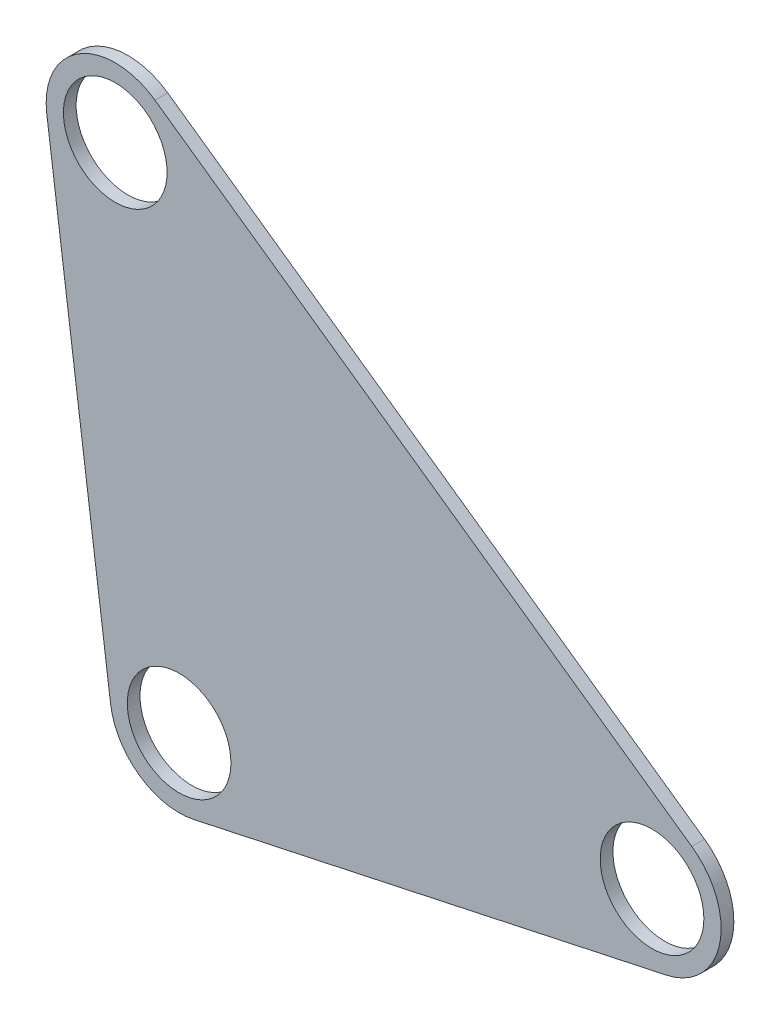
ISO-10303-21;
HEADER;
FILE_DESCRIPTION(('STEP AP214'),'2;1');
FILE_NAME('part.step','',(''),(''),'','','');
FILE_SCHEMA(('AUTOMOTIVE_DESIGN { 1 0 10303 214 1 1 1 1 }'));
ENDSEC;
DATA;
#1=APPLICATION_CONTEXT('core data for automotive mechanical design processes');
#2=APPLICATION_PROTOCOL_DEFINITION('international standard','automotive_design',2000,#1);
#3=PRODUCT_CONTEXT('',#1,'mechanical');
#4=PRODUCT('Part','Part','',(#3));
#5=PRODUCT_RELATED_PRODUCT_CATEGORY('part','',(#4));
#6=PRODUCT_DEFINITION_FORMATION('','',#4);
#7=PRODUCT_DEFINITION_CONTEXT('part definition',#1,'design');
#8=PRODUCT_DEFINITION('design','',#6,#7);
#9=PRODUCT_DEFINITION_SHAPE('','',#8);
#10=(LENGTH_UNIT() NAMED_UNIT(*) SI_UNIT(.MILLI.,.METRE.));
#11=(NAMED_UNIT(*) PLANE_ANGLE_UNIT() SI_UNIT($,.RADIAN.));
#12=(NAMED_UNIT(*) SI_UNIT($,.STERADIAN.) SOLID_ANGLE_UNIT());
#13=UNCERTAINTY_MEASURE_WITH_UNIT(LENGTH_MEASURE(1.E-05),#10,'distance_accuracy_value','');
#14=(GEOMETRIC_REPRESENTATION_CONTEXT(3) GLOBAL_UNCERTAINTY_ASSIGNED_CONTEXT((#13)) GLOBAL_UNIT_ASSIGNED_CONTEXT((#10,
#11,#12)) REPRESENTATION_CONTEXT('',''));
#15=CARTESIAN_POINT('',(0.,0.,0.));
#16=DIRECTION('',(0.,0.,1.));
#17=DIRECTION('',(1.,0.,0.));
#18=AXIS2_PLACEMENT_3D('',#15,#16,#17);
#19=CARTESIAN_POINT('',(31.7651022120724,-5.87017847864854,-0.7366));
#20=DIRECTION('',(0.,0.,1.));
#21=DIRECTION('',(1.,0.,0.));
#22=AXIS2_PLACEMENT_3D('',#19,#20,#21);
#23=CYLINDRICAL_SURFACE('',#22,4.);
#24=CARTESIAN_POINT('',(31.7651022120724,-5.87017847864854,0.));
#25=DIRECTION('',(0.,0.,1.));
#26=DIRECTION('',(-1.,0.,0.));
#27=AXIS2_PLACEMENT_3D('',#24,#25,#26);
#28=CIRCLE('',#27,4.);
#29=CARTESIAN_POINT('',(27.8001194318302,-6.39829925307725,0.));
#30=VERTEX_POINT('',#29);
#31=CARTESIAN_POINT('',(32.6051262996845,-9.78097884842344,0.));
#32=VERTEX_POINT('',#31);
#33=EDGE_CURVE('E126',#30,#32,#28,.T.);
#34=ORIENTED_EDGE('',*,*,#33,.F.);
#35=DIRECTION('',(0.,0.,1.));
#36=VECTOR('',#35,1.);
#37=CARTESIAN_POINT('',(27.8001194318302,-6.39829925307725,-0.7366));
#38=LINE('',#37,#36);
#39=CARTESIAN_POINT('',(27.8001194318302,-6.39829925307725,-0.7366));
#40=VERTEX_POINT('',#39);
#41=EDGE_CURVE('E11',#40,#30,#38,.T.);
#42=ORIENTED_EDGE('',*,*,#41,.F.);
#43=CARTESIAN_POINT('',(31.7651022120724,-5.87017847864854,-0.7366));
#44=DIRECTION('',(0.,0.,1.));
#45=DIRECTION('',(-1.,0.,0.));
#46=AXIS2_PLACEMENT_3D('',#43,#44,#45);
#47=CIRCLE('',#46,4.);
#48=CARTESIAN_POINT('',(32.6051262996845,-9.78097884842344,-0.7366));
#49=VERTEX_POINT('',#48);
#50=EDGE_CURVE('E141',#40,#49,#47,.T.);
#51=ORIENTED_EDGE('',*,*,#50,.T.);
#52=DIRECTION('',(0.,0.,1.));
#53=VECTOR('',#52,1.);
#54=CARTESIAN_POINT('',(32.6051262996845,-9.78097884842344,-0.7366));
#55=LINE('',#54,#53);
#56=EDGE_CURVE('E44',#49,#32,#55,.T.);
#57=ORIENTED_EDGE('',*,*,#56,.T.);
#58=EDGE_LOOP('',(#34,#42,#51,#57));
#59=FACE_BOUND('',#58,.T.);
#60=ADVANCED_FACE('F41',(#59),#23,.T.);
#61=CARTESIAN_POINT('',(27.8001194318302,-6.39829925307725,-0.7366));
#62=DIRECTION('',(-0.991245695060539,-0.132030193607179,0.));
#63=DIRECTION('',(0.132030193607179,-0.991245695060539,0.));
#64=AXIS2_PLACEMENT_3D('',#61,#62,#63);
#65=PLANE('',#64);
#66=DIRECTION('',(0.132030193607179,-0.991245695060539,0.));
#67=VECTOR('',#66,1.);
#68=CARTESIAN_POINT('',(27.8001194318302,-6.39829925307725,0.));
#69=LINE('',#68,#67);
#70=CARTESIAN_POINT('',(24.1032740108292,21.3565802086178,0.));
#71=VERTEX_POINT('',#70);
#72=EDGE_CURVE('E139',#71,#30,#69,.T.);
#73=ORIENTED_EDGE('',*,*,#72,.F.);
#74=DIRECTION('',(0.,0.,1.));
#75=VECTOR('',#74,1.);
#76=CARTESIAN_POINT('',(24.1032740108292,21.3565802086178,-0.7366));
#77=LINE('',#76,#75);
#78=CARTESIAN_POINT('',(24.1032740108292,21.3565802086178,-0.7366));
#79=VERTEX_POINT('',#78);
#80=EDGE_CURVE('E50',#79,#71,#77,.T.);
#81=ORIENTED_EDGE('',*,*,#80,.F.);
#82=DIRECTION('',(0.132030193607179,-0.991245695060539,0.));
#83=VECTOR('',#82,1.);
#84=CARTESIAN_POINT('',(27.8001194318302,-6.39829925307725,-0.7366));
#85=LINE('',#84,#83);
#86=EDGE_CURVE('E116',#79,#40,#85,.T.);
#87=ORIENTED_EDGE('',*,*,#86,.T.);
#88=ORIENTED_EDGE('',*,*,#41,.T.);
#89=EDGE_LOOP('',(#73,#81,#87,#88));
#90=FACE_BOUND('',#89,.T.);
#91=ADVANCED_FACE('F149',(#90),#65,.T.);
#92=CARTESIAN_POINT('',(28.0682567910714,21.8847009830465,-0.7366));
#93=DIRECTION('',(0.,0.,1.));
#94=DIRECTION('',(1.,0.,0.));
#95=AXIS2_PLACEMENT_3D('',#92,#93,#94);
#96=CYLINDRICAL_SURFACE('',#95,4.);
#97=CARTESIAN_POINT('',(28.0682567910714,21.8847009830465,0.));
#98=DIRECTION('',(0.,0.,1.));
#99=DIRECTION('',(1.,0.,0.));
#100=AXIS2_PLACEMENT_3D('',#97,#98,#99);
#101=CIRCLE('',#100,4.);
#102=CARTESIAN_POINT('',(30.3708579330093,25.1554849840387,0.));
#103=VERTEX_POINT('',#102);
#104=EDGE_CURVE('E103',#103,#71,#101,.T.);
#105=ORIENTED_EDGE('',*,*,#104,.F.);
#106=DIRECTION('',(0.,0.,1.));
#107=VECTOR('',#106,1.);
#108=CARTESIAN_POINT('',(30.3708579330093,25.1554849840387,-0.7366));
#109=LINE('',#108,#107);
#110=CARTESIAN_POINT('',(30.3708579330093,25.1554849840387,-0.7366));
#111=VERTEX_POINT('',#110);
#112=EDGE_CURVE('E98',#111,#103,#109,.T.);
#113=ORIENTED_EDGE('',*,*,#112,.F.);
#114=CARTESIAN_POINT('',(28.0682567910714,21.8847009830465,-0.7366));
#115=DIRECTION('',(0.,0.,1.));
#116=DIRECTION('',(1.,0.,0.));
#117=AXIS2_PLACEMENT_3D('',#114,#115,#116);
#118=CIRCLE('',#117,4.);
#119=EDGE_CURVE('E101',#111,#79,#118,.T.);
#120=ORIENTED_EDGE('',*,*,#119,.T.);
#121=ORIENTED_EDGE('',*,*,#80,.T.);
#122=EDGE_LOOP('',(#105,#113,#120,#121));
#123=FACE_BOUND('',#122,.T.);
#124=ADVANCED_FACE('F100',(#123),#96,.T.);
#125=CARTESIAN_POINT('',(61.4433059424346,3.28077413562832,-0.7366));
#126=DIRECTION('',(0.575650285484483,0.817696000248034,0.));
#127=DIRECTION('',(-0.817696000248034,0.575650285484483,0.));
#128=AXIS2_PLACEMENT_3D('',#125,#126,#127);
#129=PLANE('',#128);
#130=DIRECTION('',(-0.817696000248034,0.575650285484483,0.));
#131=VECTOR('',#130,1.);
#132=CARTESIAN_POINT('',(61.4433059424346,3.28077413562832,0.));
#133=LINE('',#132,#131);
#134=CARTESIAN_POINT('',(61.4433059424346,3.28077413562832,0.));
#135=VERTEX_POINT('',#134);
#136=EDGE_CURVE('E136',#135,#103,#133,.T.);
#137=ORIENTED_EDGE('',*,*,#136,.F.);
#138=DIRECTION('',(0.,0.,1.));
#139=VECTOR('',#138,1.);
#140=CARTESIAN_POINT('',(61.4433059424346,3.28077413562832,-0.7366));
#141=LINE('',#140,#139);
#142=CARTESIAN_POINT('',(61.4433059424346,3.28077413562832,-0.7366));
#143=VERTEX_POINT('',#142);
#144=EDGE_CURVE('E108',#143,#135,#141,.T.);
#145=ORIENTED_EDGE('',*,*,#144,.F.);
#146=DIRECTION('',(-0.817696000248034,0.575650285484483,0.));
#147=VECTOR('',#146,1.);
#148=CARTESIAN_POINT('',(61.4433059424346,3.28077413562832,-0.7366));
#149=LINE('',#148,#147);
#150=EDGE_CURVE('E114',#143,#111,#149,.T.);
#151=ORIENTED_EDGE('',*,*,#150,.T.);
#152=ORIENTED_EDGE('',*,*,#112,.T.);
#153=EDGE_LOOP('',(#137,#145,#151,#152));
#154=FACE_BOUND('',#153,.T.);
#155=ADVANCED_FACE('F118',(#154),#129,.T.);
#156=CARTESIAN_POINT('',(59.1407048004966,0.00999013463617859,-0.7366));
#157=DIRECTION('',(0.,0.,1.));
#158=DIRECTION('',(1.,0.,0.));
#159=AXIS2_PLACEMENT_3D('',#156,#157,#158);
#160=CYLINDRICAL_SURFACE('',#159,4.);
#161=CARTESIAN_POINT('',(59.1407048004966,0.00999013463617859,0.));
#162=DIRECTION('',(0.,0.,1.));
#163=DIRECTION('',(1.,0.,0.));
#164=AXIS2_PLACEMENT_3D('',#161,#162,#163);
#165=CIRCLE('',#164,4.);
#166=CARTESIAN_POINT('',(59.9807288881088,-3.90081023513872,0.));
#167=VERTEX_POINT('',#166);
#168=EDGE_CURVE('E133',#167,#135,#165,.T.);
#169=ORIENTED_EDGE('',*,*,#168,.F.);
#170=DIRECTION('',(0.,0.,1.));
#171=VECTOR('',#170,1.);
#172=CARTESIAN_POINT('',(59.9807288881088,-3.90081023513872,-0.7366));
#173=LINE('',#172,#171);
#174=CARTESIAN_POINT('',(59.9807288881088,-3.90081023513872,-0.7366));
#175=VERTEX_POINT('',#174);
#176=EDGE_CURVE('E144',#175,#167,#173,.T.);
#177=ORIENTED_EDGE('',*,*,#176,.F.);
#178=CARTESIAN_POINT('',(59.1407048004966,0.00999013463617859,-0.7366));
#179=DIRECTION('',(0.,0.,1.));
#180=DIRECTION('',(1.,0.,0.));
#181=AXIS2_PLACEMENT_3D('',#178,#179,#180);
#182=CIRCLE('',#181,4.);
#183=EDGE_CURVE('E119',#175,#143,#182,.T.);
#184=ORIENTED_EDGE('',*,*,#183,.T.);
#185=ORIENTED_EDGE('',*,*,#144,.T.);
#186=EDGE_LOOP('',(#169,#177,#184,#185));
#187=FACE_BOUND('',#186,.T.);
#188=ADVANCED_FACE('F162',(#187),#160,.T.);
#189=CARTESIAN_POINT('',(32.6051262996845,-9.78097884842344,-0.7366));
#190=DIRECTION('',(0.210006021903026,-0.977700092443724,0.));
#191=DIRECTION('',(0.977700092443724,0.210006021903026,0.));
#192=AXIS2_PLACEMENT_3D('',#189,#190,#191);
#193=PLANE('',#192);
#194=DIRECTION('',(0.977700092443724,0.210006021903026,0.));
#195=VECTOR('',#194,1.);
#196=CARTESIAN_POINT('',(32.6051262996845,-9.78097884842344,0.));
#197=LINE('',#196,#195);
#198=EDGE_CURVE('E129',#32,#167,#197,.T.);
#199=ORIENTED_EDGE('',*,*,#198,.F.);
#200=ORIENTED_EDGE('',*,*,#56,.F.);
#201=DIRECTION('',(0.977700092443724,0.210006021903026,0.));
#202=VECTOR('',#201,1.);
#203=CARTESIAN_POINT('',(32.6051262996845,-9.78097884842344,-0.7366));
#204=LINE('',#203,#202);
#205=EDGE_CURVE('E121',#49,#175,#204,.T.);
#206=ORIENTED_EDGE('',*,*,#205,.T.);
#207=ORIENTED_EDGE('',*,*,#176,.T.);
#208=EDGE_LOOP('',(#199,#200,#206,#207));
#209=FACE_BOUND('',#208,.T.);
#210=ADVANCED_FACE('F146',(#209),#193,.T.);
#211=CARTESIAN_POINT('',(31.7651022120724,-5.87017847864854,-0.7366));
#212=DIRECTION('',(0.,0.,-1.));
#213=DIRECTION('',(-1.,0.,0.));
#214=AXIS2_PLACEMENT_3D('',#211,#212,#213);
#215=PLANE('',#214);
#216=CARTESIAN_POINT('',(59.1407048004966,0.00999013463617859,-0.7366));
#217=DIRECTION('',(0.,0.,1.));
#218=DIRECTION('',(1.,0.,0.));
#219=AXIS2_PLACEMENT_3D('',#216,#217,#218);
#220=CIRCLE('',#219,3.);
#221=CARTESIAN_POINT('',(62.1407048004966,0.00999013463617859,-0.7366));
#222=VERTEX_POINT('',#221);
#223=EDGE_CURVE('E192',#222,#222,#220,.T.);
#224=ORIENTED_EDGE('',*,*,#223,.T.);
#225=EDGE_LOOP('',(#224));
#226=FACE_BOUND('',#225,.T.);
#227=CARTESIAN_POINT('',(31.7651022120724,-5.87017847864854,-0.7366));
#228=DIRECTION('',(0.,0.,1.));
#229=DIRECTION('',(1.,0.,0.));
#230=AXIS2_PLACEMENT_3D('',#227,#228,#229);
#231=CIRCLE('',#230,3.);
#232=CARTESIAN_POINT('',(34.7651022120724,-5.87017847864854,-0.7366));
#233=VERTEX_POINT('',#232);
#234=EDGE_CURVE('E200',#233,#233,#231,.T.);
#235=ORIENTED_EDGE('',*,*,#234,.T.);
#236=EDGE_LOOP('',(#235));
#237=FACE_BOUND('',#236,.T.);
#238=CARTESIAN_POINT('',(28.0682567910714,21.8847009830465,-0.7366));
#239=DIRECTION('',(0.,0.,1.));
#240=DIRECTION('',(1.,0.,0.));
#241=AXIS2_PLACEMENT_3D('',#238,#239,#240);
#242=CIRCLE('',#241,3.);
#243=CARTESIAN_POINT('',(31.0682567910714,21.8847009830465,-0.7366));
#244=VERTEX_POINT('',#243);
#245=EDGE_CURVE('E130',#244,#244,#242,.T.);
#246=ORIENTED_EDGE('',*,*,#245,.T.);
#247=EDGE_LOOP('',(#246));
#248=FACE_BOUND('',#247,.T.);
#249=ORIENTED_EDGE('',*,*,#50,.F.);
#250=ORIENTED_EDGE('',*,*,#86,.F.);
#251=ORIENTED_EDGE('',*,*,#119,.F.);
#252=ORIENTED_EDGE('',*,*,#150,.F.);
#253=ORIENTED_EDGE('',*,*,#183,.F.);
#254=ORIENTED_EDGE('',*,*,#205,.F.);
#255=EDGE_LOOP('',(#249,#250,#251,#252,#253,#254));
#256=FACE_BOUND('',#255,.T.);
#257=ADVANCED_FACE('F112',(#226,#237,#248,#256),#215,.T.);
#258=CARTESIAN_POINT('',(31.7651022120724,-5.87017847864854,0.));
#259=DIRECTION('',(0.,0.,-1.));
#260=DIRECTION('',(-1.,0.,0.));
#261=AXIS2_PLACEMENT_3D('',#258,#259,#260);
#262=PLANE('',#261);
#263=CARTESIAN_POINT('',(59.1407048004966,0.00999013463617859,0.));
#264=DIRECTION('',(0.,0.,1.));
#265=DIRECTION('',(1.,0.,0.));
#266=AXIS2_PLACEMENT_3D('',#263,#264,#265);
#267=CIRCLE('',#266,3.);
#268=CARTESIAN_POINT('',(62.1407048004966,0.00999013463617859,0.));
#269=VERTEX_POINT('',#268);
#270=EDGE_CURVE('E195',#269,#269,#267,.T.);
#271=ORIENTED_EDGE('',*,*,#270,.F.);
#272=EDGE_LOOP('',(#271));
#273=FACE_BOUND('',#272,.T.);
#274=CARTESIAN_POINT('',(31.7651022120724,-5.87017847864854,0.));
#275=DIRECTION('',(0.,0.,1.));
#276=DIRECTION('',(1.,0.,0.));
#277=AXIS2_PLACEMENT_3D('',#274,#275,#276);
#278=CIRCLE('',#277,3.);
#279=CARTESIAN_POINT('',(34.7651022120724,-5.87017847864854,0.));
#280=VERTEX_POINT('',#279);
#281=EDGE_CURVE('E197',#280,#280,#278,.T.);
#282=ORIENTED_EDGE('',*,*,#281,.F.);
#283=EDGE_LOOP('',(#282));
#284=FACE_BOUND('',#283,.T.);
#285=CARTESIAN_POINT('',(28.0682567910714,21.8847009830465,0.));
#286=DIRECTION('',(0.,0.,1.));
#287=DIRECTION('',(1.,0.,0.));
#288=AXIS2_PLACEMENT_3D('',#285,#286,#287);
#289=CIRCLE('',#288,3.);
#290=CARTESIAN_POINT('',(31.0682567910714,21.8847009830465,0.));
#291=VERTEX_POINT('',#290);
#292=EDGE_CURVE('E203',#291,#291,#289,.T.);
#293=ORIENTED_EDGE('',*,*,#292,.F.);
#294=EDGE_LOOP('',(#293));
#295=FACE_BOUND('',#294,.T.);
#296=ORIENTED_EDGE('',*,*,#33,.T.);
#297=ORIENTED_EDGE('',*,*,#198,.T.);
#298=ORIENTED_EDGE('',*,*,#168,.T.);
#299=ORIENTED_EDGE('',*,*,#136,.T.);
#300=ORIENTED_EDGE('',*,*,#104,.T.);
#301=ORIENTED_EDGE('',*,*,#72,.T.);
#302=EDGE_LOOP('',(#296,#297,#298,#299,#300,#301));
#303=FACE_BOUND('',#302,.T.);
#304=ADVANCED_FACE('F148',(#273,#284,#295,#303),#262,.F.);
#305=CARTESIAN_POINT('',(28.0682567910714,21.8847009830465,-0.7366));
#306=DIRECTION('',(0.,0.,1.));
#307=DIRECTION('',(1.,0.,0.));
#308=AXIS2_PLACEMENT_3D('',#305,#306,#307);
#309=CYLINDRICAL_SURFACE('',#308,3.);
#310=ORIENTED_EDGE('',*,*,#245,.F.);
#311=EDGE_LOOP('',(#310));
#312=FACE_BOUND('',#311,.T.);
#313=ORIENTED_EDGE('',*,*,#292,.T.);
#314=EDGE_LOOP('',(#313));
#315=FACE_BOUND('',#314,.T.);
#316=ADVANCED_FACE('F173',(#312,#315),#309,.F.);
#317=CARTESIAN_POINT('',(31.7651022120724,-5.87017847864854,-0.7366));
#318=DIRECTION('',(0.,0.,1.));
#319=DIRECTION('',(1.,0.,0.));
#320=AXIS2_PLACEMENT_3D('',#317,#318,#319);
#321=CYLINDRICAL_SURFACE('',#320,3.);
#322=ORIENTED_EDGE('',*,*,#234,.F.);
#323=EDGE_LOOP('',(#322));
#324=FACE_BOUND('',#323,.T.);
#325=ORIENTED_EDGE('',*,*,#281,.T.);
#326=EDGE_LOOP('',(#325));
#327=FACE_BOUND('',#326,.T.);
#328=ADVANCED_FACE('F180',(#324,#327),#321,.F.);
#329=CARTESIAN_POINT('',(59.1407048004966,0.00999013463617859,-0.7366));
#330=DIRECTION('',(0.,0.,1.));
#331=DIRECTION('',(1.,0.,0.));
#332=AXIS2_PLACEMENT_3D('',#329,#330,#331);
#333=CYLINDRICAL_SURFACE('',#332,3.);
#334=ORIENTED_EDGE('',*,*,#223,.F.);
#335=EDGE_LOOP('',(#334));
#336=FACE_BOUND('',#335,.T.);
#337=ORIENTED_EDGE('',*,*,#270,.T.);
#338=EDGE_LOOP('',(#337));
#339=FACE_BOUND('',#338,.T.);
#340=ADVANCED_FACE('F184',(#336,#339),#333,.F.);
#341=CLOSED_SHELL('',(#60,#91,#124,#155,#188,#210,#257,#304,#316,#328,#340));
#342=MANIFOLD_SOLID_BREP('B2',#341);
#343=ADVANCED_BREP_SHAPE_REPRESENTATION('',(#18,#342),#14);
#344=SHAPE_DEFINITION_REPRESENTATION(#9,#343);
ENDSEC;
END-ISO-10303-21;
